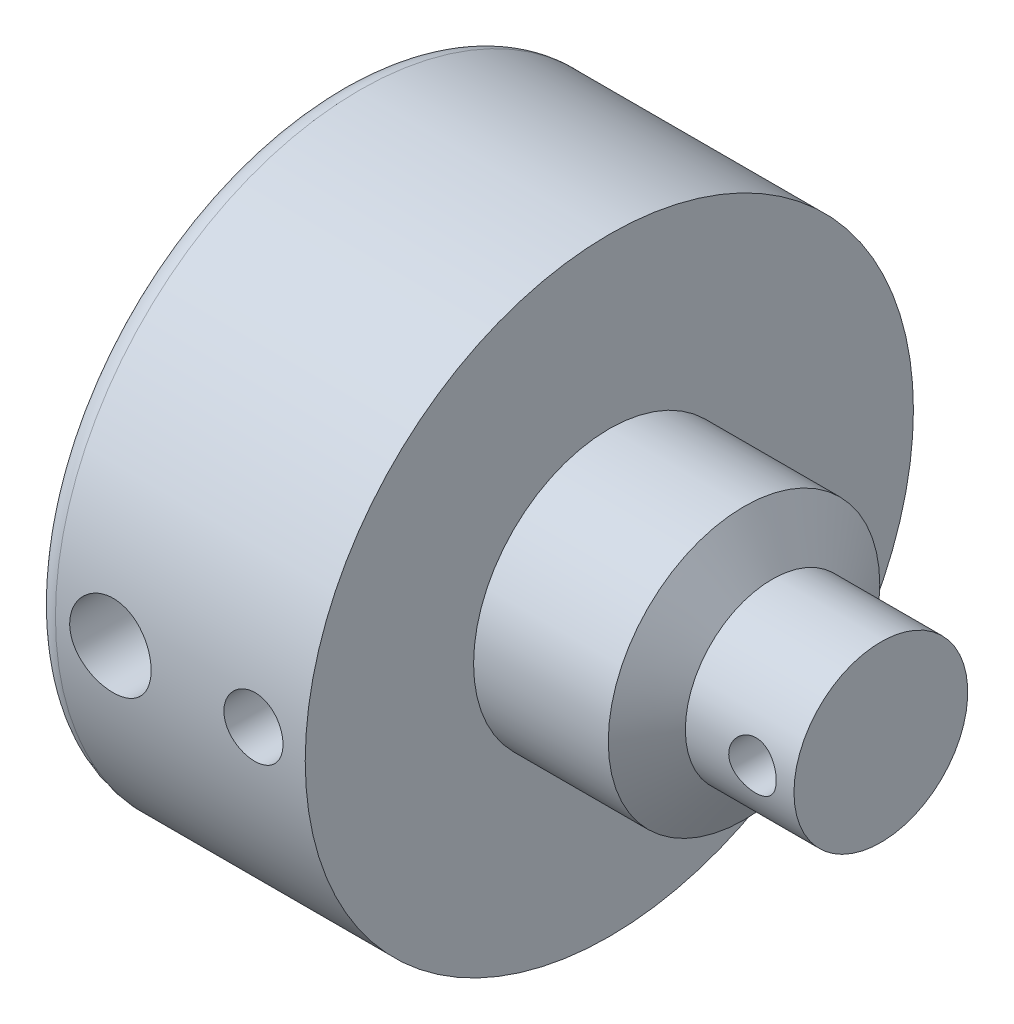
ISO-10303-21;
HEADER;
FILE_DESCRIPTION(('STEP AP214'),'2;1');
FILE_NAME('part.step','',(''),(''),'','','');
FILE_SCHEMA(('AUTOMOTIVE_DESIGN { 1 0 10303 214 1 1 1 1 }'));
ENDSEC;
DATA;
#1=APPLICATION_CONTEXT('core data for automotive mechanical design processes');
#2=APPLICATION_PROTOCOL_DEFINITION('international standard','automotive_design',2000,#1);
#3=PRODUCT_CONTEXT('',#1,'mechanical');
#4=PRODUCT('Part','Part','',(#3));
#5=PRODUCT_RELATED_PRODUCT_CATEGORY('part','',(#4));
#6=PRODUCT_DEFINITION_FORMATION('','',#4);
#7=PRODUCT_DEFINITION_CONTEXT('part definition',#1,'design');
#8=PRODUCT_DEFINITION('design','',#6,#7);
#9=PRODUCT_DEFINITION_SHAPE('','',#8);
#10=(LENGTH_UNIT() NAMED_UNIT(*) SI_UNIT(.MILLI.,.METRE.));
#11=(NAMED_UNIT(*) PLANE_ANGLE_UNIT() SI_UNIT($,.RADIAN.));
#12=(NAMED_UNIT(*) SI_UNIT($,.STERADIAN.) SOLID_ANGLE_UNIT());
#13=UNCERTAINTY_MEASURE_WITH_UNIT(LENGTH_MEASURE(1.E-05),#10,'distance_accuracy_value','');
#14=(GEOMETRIC_REPRESENTATION_CONTEXT(3) GLOBAL_UNCERTAINTY_ASSIGNED_CONTEXT((#13)) GLOBAL_UNIT_ASSIGNED_CONTEXT((#10,
#11,#12)) REPRESENTATION_CONTEXT('',''));
#15=CARTESIAN_POINT('',(0.,0.,0.));
#16=DIRECTION('',(0.,0.,1.));
#17=DIRECTION('',(1.,0.,0.));
#18=AXIS2_PLACEMENT_3D('',#15,#16,#17);
#19=CARTESIAN_POINT('',(0.,0.,0.));
#20=DIRECTION('',(1.,0.,0.));
#21=DIRECTION('',(0.,0.,-1.));
#22=AXIS2_PLACEMENT_3D('',#19,#20,#21);
#23=PLANE('',#22);
#24=CARTESIAN_POINT('',(0.,0.,0.));
#25=DIRECTION('',(1.,0.,0.));
#26=DIRECTION('',(0.,0.,-1.));
#27=AXIS2_PLACEMENT_3D('',#24,#25,#26);
#28=CIRCLE('',#27,16.51);
#29=CARTESIAN_POINT('',(0.,0.,-16.51));
#30=VERTEX_POINT('',#29);
#31=EDGE_CURVE('E42',#30,#30,#28,.F.);
#32=ORIENTED_EDGE('',*,*,#31,.T.);
#33=EDGE_LOOP('',(#32));
#34=FACE_BOUND('',#33,.T.);
#35=ADVANCED_FACE('F34',(#34),#23,.F.);
#36=CARTESIAN_POINT('',(-88.99,0.,0.));
#37=DIRECTION('',(-1.,0.,0.));
#38=DIRECTION('',(0.,0.,1.));
#39=AXIS2_PLACEMENT_3D('',#36,#37,#38);
#40=CYLINDRICAL_SURFACE('',#39,17.78);
#41=CARTESIAN_POINT('',(1.26999999999999,0.,0.));
#42=DIRECTION('',(1.,0.,0.));
#43=DIRECTION('',(0.,0.,-1.));
#44=AXIS2_PLACEMENT_3D('',#41,#42,#43);
#45=CIRCLE('',#44,17.78);
#46=CARTESIAN_POINT('',(1.26999999999999,0.,-17.78));
#47=VERTEX_POINT('',#46);
#48=EDGE_CURVE('E10',#47,#47,#45,.T.);
#49=ORIENTED_EDGE('',*,*,#48,.T.);
#50=EDGE_LOOP('',(#49));
#51=FACE_BOUND('',#50,.T.);
#52=CARTESIAN_POINT('',(6.86386760511532,0.,17.78));
#53=CARTESIAN_POINT('',(6.85958570639568,-0.133133219016853,17.7799980584345));
#54=CARTESIAN_POINT('',(6.84410431314223,-0.265988396244947,17.7784889957615));
#55=CARTESIAN_POINT('',(6.79116271506069,-0.527275768382753,17.7726619289018));
#56=CARTESIAN_POINT('',(6.7536798048931,-0.65570324878477,17.7683410224198));
#57=CARTESIAN_POINT('',(6.65786552293635,-0.90432595281292,17.7574229931684));
#58=CARTESIAN_POINT('',(6.59954915009691,-1.02452702500808,17.7508275080889));
#59=CARTESIAN_POINT('',(6.46374945336528,-1.25342643631558,17.73613528139));
#60=CARTESIAN_POINT('',(6.38626926597332,-1.36212665359555,17.728038785492));
#61=CARTESIAN_POINT('',(6.2138069431759,-1.5656503842034,17.7112292962343));
#62=CARTESIAN_POINT('',(6.11872709191141,-1.66039083910711,17.7025130370078));
#63=CARTESIAN_POINT('',(5.91400207890148,-1.83261118944869,17.6855151200962));
#64=CARTESIAN_POINT('',(5.80435623144925,-1.91009027183263,17.6772334828969));
#65=CARTESIAN_POINT('',(5.5732015521879,-2.04579054874751,17.6620450480345));
#66=CARTESIAN_POINT('',(5.45165867093433,-2.10395424447798,17.6551423792134));
#67=CARTESIAN_POINT('',(5.20041965511415,-2.19900129674456,17.643556940088));
#68=CARTESIAN_POINT('',(5.07072391305195,-2.23588567686521,17.6388740630086));
#69=CARTESIAN_POINT('',(4.8077792292829,-2.28709624740156,17.6323072956796));
#70=CARTESIAN_POINT('',(4.67455963630728,-2.30157075378135,17.6304050073018));
#71=CARTESIAN_POINT('',(4.40757254242092,-2.30799121638701,17.6295657596181));
#72=CARTESIAN_POINT('',(4.27380506415344,-2.29993809444908,17.6306286789751));
#73=CARTESIAN_POINT('',(4.01034682624993,-2.26166419910138,17.635578724522));
#74=CARTESIAN_POINT('',(3.88063666553803,-2.23157453867262,17.6394491453475));
#75=CARTESIAN_POINT('',(3.62811500502692,-2.15026691581748,17.6495444007049));
#76=CARTESIAN_POINT('',(3.50530370487538,-2.09904834229424,17.6557693033333));
#77=CARTESIAN_POINT('',(3.26949736252719,-1.97670650165135,17.6698845812371));
#78=CARTESIAN_POINT('',(3.15654464317299,-1.9055024651611,17.6777816820589));
#79=CARTESIAN_POINT('',(2.94412633229655,-1.7452857670472,17.6943167190002));
#80=CARTESIAN_POINT('',(2.84466142910759,-1.6562721971104,17.7029546928925));
#81=CARTESIAN_POINT('',(2.66124626052634,-1.46214887454438,17.7200470186109));
#82=CARTESIAN_POINT('',(2.57742130029724,-1.35692050628223,17.7284994454199));
#83=CARTESIAN_POINT('',(2.42860788486312,-1.13380956336479,17.7441641665386));
#84=CARTESIAN_POINT('',(2.36361934634153,-1.01592704468403,17.7513764663336));
#85=CARTESIAN_POINT('',(2.25439033526242,-0.770893885665809,17.76370302097));
#86=CARTESIAN_POINT('',(2.21013684398438,-0.643749118836235,17.7688185920115));
#87=CARTESIAN_POINT('',(2.14363527596981,-0.383753688892956,17.7763335104001));
#88=CARTESIAN_POINT('',(2.12138598910591,-0.25090333997865,17.7787330071195));
#89=CARTESIAN_POINT('',(2.09965025601776,0.015612492781322,17.780488572357));
#90=CARTESIAN_POINT('',(2.09998624282188,0.149263358908925,17.7798684174134));
#91=CARTESIAN_POINT('',(2.12296843250587,0.414582531976226,17.7756610795788));
#92=CARTESIAN_POINT('',(2.14561422868817,0.546250875011986,17.7720739507746));
#93=CARTESIAN_POINT('',(2.21244166352204,0.803492418330639,17.7623008588146));
#94=CARTESIAN_POINT('',(2.2565613472422,0.929082017407327,17.7561223790886));
#95=CARTESIAN_POINT('',(2.36502716275998,1.17107899233285,17.7418060638281));
#96=CARTESIAN_POINT('',(2.42937415773205,1.28748597606015,17.7336681446805));
#97=CARTESIAN_POINT('',(2.5769586308495,1.50864402126496,17.7162297083618));
#98=CARTESIAN_POINT('',(2.66031647451484,1.61331418506677,17.7069219608029));
#99=CARTESIAN_POINT('',(2.84335803136614,1.80723711167386,17.6881826277848));
#100=CARTESIAN_POINT('',(2.9430424261263,1.89648923051201,17.6787510371708));
#101=CARTESIAN_POINT('',(3.15662143880773,2.05757723474089,17.6607305500918));
#102=CARTESIAN_POINT('',(3.27059682735353,2.12930669000533,17.6521469831524));
#103=CARTESIAN_POINT('',(3.50909298024273,2.25260121134459,17.6368383120406));
#104=CARTESIAN_POINT('',(3.63361343362549,2.30416687177253,17.6301131530911));
#105=CARTESIAN_POINT('',(3.88916557003891,2.3854579223865,17.6192984620447));
#106=CARTESIAN_POINT('',(4.02016992328124,2.41526782573885,17.6151987387822));
#107=CARTESIAN_POINT('',(4.28537992784738,2.45247935407298,17.6100569371201));
#108=CARTESIAN_POINT('',(4.41958541289471,2.45988214040471,17.6090147002526));
#109=CARTESIAN_POINT('',(4.68627990667047,2.4520882707029,17.610101511427));
#110=CARTESIAN_POINT('',(4.81877415849664,2.43706624620115,17.6122060543651));
#111=CARTESIAN_POINT('',(5.07933538896001,2.38519216542068,17.6193057474439));
#112=CARTESIAN_POINT('',(5.20740233895642,2.34833996794774,17.6243009162807));
#113=CARTESIAN_POINT('',(5.45558700458868,2.25385893545025,17.6366316470663));
#114=CARTESIAN_POINT('',(5.57570007012536,2.19621807143315,17.6439685637427));
#115=CARTESIAN_POINT('',(5.80458100658957,2.06180846439726,17.6601786436772));
#116=CARTESIAN_POINT('',(5.91334863499238,1.98503931260317,17.6690518397646));
#117=CARTESIAN_POINT('',(6.11737208400474,1.8138300818362,17.687449563459));
#118=CARTESIAN_POINT('',(6.21251446797077,1.71925529617804,17.6969786796258));
#119=CARTESIAN_POINT('',(6.38563060987582,1.51543832904699,17.7155947532888));
#120=CARTESIAN_POINT('',(6.46360044267121,1.40619280343787,17.7246816093281));
#121=CARTESIAN_POINT('',(6.60037344731507,1.17569856539288,17.7414633327103));
#122=CARTESIAN_POINT('',(6.65911027497614,1.05441014712695,17.7491533418606));
#123=CARTESIAN_POINT('',(6.75528356120772,0.803647655080538,17.7622704727334));
#124=CARTESIAN_POINT('',(6.79274293227899,0.674182553948143,17.7677000269237));
#125=CARTESIAN_POINT('',(6.8368347283638,0.453362235511105,17.7744441014818));
#126=CARTESIAN_POINT('',(6.8495142243945,0.36319124087437,17.77652114039));
#127=CARTESIAN_POINT('',(6.8644927280359,0.181970266888062,17.7792997463594));
#128=CARTESIAN_POINT('',(6.86679183018841,0.0909202955515396,17.7800013259479));
#129=CARTESIAN_POINT('',(6.86386760511532,0.,17.78));
#130=B_SPLINE_CURVE_WITH_KNOTS('',3,(#52,#53,#54,#55,#56,#57,#58,#59,#60,#61,#62,#63,#64,#65,
#66,#67,#68,#69,#70,#71,#72,#73,#74,#75,#76,#77,#78,#79,#80,#81,#82,#83,#84,#85,#86,#87,#88,#89,
#90,#91,#92,#93,#94,#95,#96,#97,#98,#99,#100,#101,#102,#103,#104,#105,#106,#107,#108,#109,#110,
#111,#112,#113,#114,#115,#116,#117,#118,#119,#120,#121,#122,#123,#124,#125,#126,#127,#128,#129),
.UNSPECIFIED.,.T.,.F.,(4,2,2,2,2,2,2,2,2,2,2,2,2,2,2,2,2,2,2,2,2,2,2,2,2,2,2,2,2,2,2,2,2,2,2,2,
2,2,4),(0.,0.399273542317246,0.798959857073893,1.19835899759977,1.59769281253483,
1.99931417559296,2.40095445202642,2.80377984779257,3.206585865105,3.60671440662996,
4.0068265750338,4.40457729970184,4.80233952904436,5.2017330144915,5.60114687480519,
6.00363493728698,6.40612121947135,6.80835445660121,7.21056557157178,7.609614847844,
8.00865684976575,8.40655432805956,8.8044687884214,9.20497621795633,9.60550037148548,
10.0083999220181,10.4112875956864,10.8126017442171,11.213895092475,11.6120796579748,
12.0102667988997,12.4086847143693,12.8071111448388,13.2086826633523,13.610345874348,
14.0133803724696,14.415980038504,14.6886572814534,14.9613320409272),.UNSPECIFIED.);
#131=CARTESIAN_POINT('',(6.86386760511532,0.,17.78));
#132=VERTEX_POINT('',#131);
#133=EDGE_CURVE('E48',#132,#132,#130,.T.);
#134=ORIENTED_EDGE('',*,*,#133,.T.);
#135=EDGE_LOOP('',(#134));
#136=FACE_BOUND('',#135,.T.);
#137=CARTESIAN_POINT('',(4.48384506152944,-2.45698699449018,-17.6094183580522));
#138=CARTESIAN_POINT('',(4.61695579102001,-2.45698139443148,-17.6094204111506));
#139=CARTESIAN_POINT('',(4.7501477261366,-2.44579472551361,-17.6109911914985));
#140=CARTESIAN_POINT('',(5.01281908287056,-2.40134848208744,-17.6171055877044));
#141=CARTESIAN_POINT('',(5.14229457091657,-2.3680663592834,-17.6216522403576));
#142=CARTESIAN_POINT('',(5.39369227998193,-2.28043137488042,-17.6332065571522));
#143=CARTESIAN_POINT('',(5.51561978185678,-2.22609344244245,-17.6402124772732));
#144=CARTESIAN_POINT('',(5.7486000661167,-2.09791994885535,-17.6559134886237));
#145=CARTESIAN_POINT('',(5.85965458126951,-2.02408750139497,-17.664608310041));
#146=CARTESIAN_POINT('',(6.0684687495902,-1.85851174841175,-17.6827964470673));
#147=CARTESIAN_POINT('',(6.1661486574396,-1.76666833209071,-17.6922940487103));
#148=CARTESIAN_POINT('',(6.34475122702087,-1.5678901244732,-17.7110153998516));
#149=CARTESIAN_POINT('',(6.42567302629806,-1.46095455693642,-17.7202391352345));
#150=CARTESIAN_POINT('',(6.56875136840333,-1.23451975126827,-17.7374542230254));
#151=CARTESIAN_POINT('',(6.63083527468014,-1.11497421829503,-17.7454407484296));
#152=CARTESIAN_POINT('',(6.73400996448099,-0.867027742796573,-17.7592810253214));
#153=CARTESIAN_POINT('',(6.77510163775906,-0.738627175853085,-17.7651348671995));
#154=CARTESIAN_POINT('',(6.83488587638111,-0.477431277215584,-17.7740660601771));
#155=CARTESIAN_POINT('',(6.85371140762051,-0.34466695022754,-17.7771598657275));
#156=CARTESIAN_POINT('',(6.86884132097137,-0.0778284596777565,-17.7803301698352));
#157=CARTESIAN_POINT('',(6.86514671249876,0.0562456449071287,-17.7804068036295));
#158=CARTESIAN_POINT('',(6.83544723301046,0.320992086994914,-17.7775921884086));
#159=CARTESIAN_POINT('',(6.80958537878025,0.451680710144564,-17.7747199412907));
#160=CARTESIAN_POINT('',(6.73650940733452,0.706857393180886,-17.7664025714509));
#161=CARTESIAN_POINT('',(6.68929483427894,0.831345320631476,-17.7609573938016));
#162=CARTESIAN_POINT('',(6.57470350642792,1.07102425999765,-17.7481201809824));
#163=CARTESIAN_POINT('',(6.5072654290608,1.18618562307738,-17.7407222328294));
#164=CARTESIAN_POINT('',(6.35418607192318,1.40361594252604,-17.7248459687285));
#165=CARTESIAN_POINT('',(6.26854383452122,1.505884220202,-17.7163675959541));
#166=CARTESIAN_POINT('',(6.08068763620274,1.69546369132079,-17.699235920183));
#167=CARTESIAN_POINT('',(5.97834895383694,1.78265126652442,-17.6905817666875));
#168=CARTESIAN_POINT('',(5.76043173511426,1.93862852803056,-17.6741701298749));
#169=CARTESIAN_POINT('',(5.64485314539114,2.00741814017247,-17.6664126501723));
#170=CARTESIAN_POINT('',(5.40362053676357,2.12465413906933,-17.6526980223655));
#171=CARTESIAN_POINT('',(5.27796118771723,2.17308967816899,-17.6467418347285));
#172=CARTESIAN_POINT('',(5.02019555582382,2.24812573455412,-17.6373403313954));
#173=CARTESIAN_POINT('',(4.88808963192398,2.27472746608615,-17.6338948760707));
#174=CARTESIAN_POINT('',(4.62227537269179,2.30517369958307,-17.6299407812416));
#175=CARTESIAN_POINT('',(4.48858734589813,2.30919269816107,-17.6294096237338));
#176=CARTESIAN_POINT('',(4.22244522364636,2.29482047400357,-17.6312860975552));
#177=CARTESIAN_POINT('',(4.08999109796462,2.27642980164071,-17.6336936567108));
#178=CARTESIAN_POINT('',(3.83060522113766,2.21790847739368,-17.6411489869354));
#179=CARTESIAN_POINT('',(3.70365389690635,2.17786313717458,-17.6461863946653));
#180=CARTESIAN_POINT('',(3.45826332849551,2.07725922253922,-17.6583109636757));
#181=CARTESIAN_POINT('',(3.33982442512084,2.0166998273724,-17.6653982069666));
#182=CARTESIAN_POINT('',(3.11403414809294,1.87636380160495,-17.6808555625015));
#183=CARTESIAN_POINT('',(3.00675409212219,1.79647326662005,-17.6892331674134));
#184=CARTESIAN_POINT('',(2.80705630778461,1.61990609035729,-17.7062743455213));
#185=CARTESIAN_POINT('',(2.71463924544246,1.52322869724806,-17.7149379315115));
#186=CARTESIAN_POINT('',(2.54667358988012,1.31507116077532,-17.731608502625));
#187=CARTESIAN_POINT('',(2.47123992686293,1.20349785021792,-17.7396107950099));
#188=CARTESIAN_POINT('',(2.34017943495022,0.969169325091413,-17.7539536547885));
#189=CARTESIAN_POINT('',(2.28455215715091,0.84641436402914,-17.7602942598429));
#190=CARTESIAN_POINT('',(2.19487121769505,0.593583763687526,-17.7705375010892));
#191=CARTESIAN_POINT('',(2.16075234722457,0.46353156657275,-17.7744475058268));
#192=CARTESIAN_POINT('',(2.11484494118335,0.199492376845227,-17.7793708440008));
#193=CARTESIAN_POINT('',(2.10305524185582,0.0655055896659679,-17.7803843283999));
#194=CARTESIAN_POINT('',(2.1021648313499,-0.201479190728729,-17.7793557189366));
#195=CARTESIAN_POINT('',(2.11288737190209,-0.334476720665319,-17.7773374633044));
#196=CARTESIAN_POINT('',(2.15634120498969,-0.596748427999413,-17.7704672470181));
#197=CARTESIAN_POINT('',(2.18907246549049,-0.726022610816117,-17.7656152904885));
#198=CARTESIAN_POINT('',(2.27555662244303,-0.977147747171236,-17.7535740403793));
#199=CARTESIAN_POINT('',(2.3292997632499,-1.09900211536821,-17.7463858317634));
#200=CARTESIAN_POINT('',(2.4562637025817,-1.33198363265894,-17.7304222025116));
#201=CARTESIAN_POINT('',(2.5294848701334,-1.44311057845874,-17.7216467518052));
#202=CARTESIAN_POINT('',(2.69397558909785,-1.65238640440449,-17.7033655886921));
#203=CARTESIAN_POINT('',(2.78537637773557,-1.75043170418363,-17.6938548931877));
#204=CARTESIAN_POINT('',(2.98335720670652,-1.92986084409845,-17.6751859019877));
#205=CARTESIAN_POINT('',(3.08994082347007,-2.01124074753258,-17.6660276899697));
#206=CARTESIAN_POINT('',(3.31580969194198,-2.15534701525348,-17.6490278341039));
#207=CARTESIAN_POINT('',(3.43514917933492,-2.21798904983643,-17.6411922094125));
#208=CARTESIAN_POINT('',(3.68269819317237,-2.32226033992483,-17.6277705683827));
#209=CARTESIAN_POINT('',(3.81089805221516,-2.36391209850436,-17.6221821441897));
#210=CARTESIAN_POINT('',(4.03041852085262,-2.41522407418137,-17.615206755328));
#211=CARTESIAN_POINT('',(4.12036348640119,-2.43086220398069,-17.6130469044275));
#212=CARTESIAN_POINT('',(4.3014746215662,-2.45174553466996,-17.6101520090002));
#213=CARTESIAN_POINT('',(4.39264077989962,-2.45699083151619,-17.6094169513184));
#214=CARTESIAN_POINT('',(4.48384506152944,-2.45698699449018,-17.6094183580522));
#215=B_SPLINE_CURVE_WITH_KNOTS('',3,(#137,#138,#139,#140,#141,#142,#143,#144,#145,#146,#147,
#148,#149,#150,#151,#152,#153,#154,#155,#156,#157,#158,#159,#160,#161,#162,#163,#164,#165,#166,
#167,#168,#169,#170,#171,#172,#173,#174,#175,#176,#177,#178,#179,#180,#181,#182,#183,#184,#185,
#186,#187,#188,#189,#190,#191,#192,#193,#194,#195,#196,#197,#198,#199,#200,#201,#202,#203,#204,
#205,#206,#207,#208,#209,#210,#211,#212,#213,#214),.UNSPECIFIED.,.T.,.F.,(4,2,2,2,2,2,2,2,2,2,2,
2,2,2,2,2,2,2,2,2,2,2,2,2,2,2,2,2,2,2,2,2,2,2,2,2,2,2,4),(0.,0.398998946937477,
0.798405697408037,1.19752977391187,1.59659014033251,1.9979349178396,2.39930034539231,
2.80219427642338,3.20507112941207,3.60552979164171,4.00597050432091,4.40384696762638,
4.80173192524086,5.20083578016219,5.59996063517552,6.00221628516238,6.40447355658263,
6.80694493901428,7.20939393723223,7.60872889328698,8.00805404203099,8.40581733335358,
8.80359654074004,9.20377922940057,9.60397984562912,10.0068123291015,10.4096356819559,
10.8112318130134,11.2128070130169,11.6112411570913,12.0096747212296,12.4079235151736,
12.8061798547963,13.2074229533575,13.6087607245488,14.0118784407294,14.4145630616365,
14.6879501015881,14.961334617365),.UNSPECIFIED.);
#216=CARTESIAN_POINT('',(4.48384506152944,-2.45698699449018,-17.6094183580522));
#217=VERTEX_POINT('',#216);
#218=EDGE_CURVE('E62',#217,#217,#215,.T.);
#219=ORIENTED_EDGE('',*,*,#218,.T.);
#220=EDGE_LOOP('',(#219));
#221=FACE_BOUND('',#220,.T.);
#222=CARTESIAN_POINT('',(14.5652504951277,0.,17.78));
#223=CARTESIAN_POINT('',(14.5556704085737,-0.0964046661283412,17.779998967886));
#224=CARTESIAN_POINT('',(14.5379553512263,-0.192066464898692,17.7792077489266));
#225=CARTESIAN_POINT('',(14.4867416174509,-0.379122146719337,17.7762045484632));
#226=CARTESIAN_POINT('',(14.4532251532419,-0.470511092019783,17.7739909647692));
#227=CARTESIAN_POINT('',(14.3713970121009,-0.646308670908005,17.7684669358356));
#228=CARTESIAN_POINT('',(14.3230944678818,-0.730721572533653,17.7651571675581));
#229=CARTESIAN_POINT('',(14.2130723050978,-0.890233679990863,17.7578790774599));
#230=CARTESIAN_POINT('',(14.1513554810057,-0.96533482054573,17.7539108928417));
#231=CARTESIAN_POINT('',(14.0160245510129,-1.10435952033824,17.7458069291774));
#232=CARTESIAN_POINT('',(13.9423748886575,-1.16824844699032,17.7416706778261));
#233=CARTESIAN_POINT('',(13.7853779963928,-1.2827636170685,17.7337594094191));
#234=CARTESIAN_POINT('',(13.7020304202388,-1.33338938674984,17.7299844052697));
#235=CARTESIAN_POINT('',(13.5279498195952,-1.41994559854923,17.7232629278947));
#236=CARTESIAN_POINT('',(13.4372138190354,-1.45587008350496,17.7203167906882));
#237=CARTESIAN_POINT('',(13.2509636240213,-1.51194853626405,17.7156205138802));
#238=CARTESIAN_POINT('',(13.1554495689924,-1.53210296395821,17.7138703394019));
#239=CARTESIAN_POINT('',(12.9627646942048,-1.55600100147949,17.7117872251446));
#240=CARTESIAN_POINT('',(12.8656020606195,-1.5598101393392,17.7114486265341));
#241=CARTESIAN_POINT('',(12.672020489026,-1.55108511285904,17.7122148027016));
#242=CARTESIAN_POINT('',(12.5756015391016,-1.53855121093547,17.713319554304));
#243=CARTESIAN_POINT('',(12.3864592526197,-1.49755360199038,17.7168324011958));
#244=CARTESIAN_POINT('',(12.2937283281344,-1.46912463130521,17.7192376540546));
#245=CARTESIAN_POINT('',(12.1143485837427,-1.39718347448946,17.7250549450996));
#246=CARTESIAN_POINT('',(12.0276998965264,-1.35367095941911,17.728467005242));
#247=CARTESIAN_POINT('',(11.8626516823836,-1.2526462507556,17.7358913078975));
#248=CARTESIAN_POINT('',(11.7842782495086,-1.19509156257959,17.7399053576768));
#249=CARTESIAN_POINT('',(11.6382738484978,-1.06767691669617,17.7480289132203));
#250=CARTESIAN_POINT('',(11.5706431324973,-0.997816670254319,17.7521384212222));
#251=CARTESIAN_POINT('',(11.4478011045918,-0.847481937894421,17.7599506899272));
#252=CARTESIAN_POINT('',(11.3926344205769,-0.766970897668338,17.763651965474));
#253=CARTESIAN_POINT('',(11.2965972860118,-0.597797359953364,17.7701489514908));
#254=CARTESIAN_POINT('',(11.2557266861594,-0.509134947606033,17.772944671418));
#255=CARTESIAN_POINT('',(11.1895100549897,-0.326309141603019,17.7772400427866));
#256=CARTESIAN_POINT('',(11.1641410236471,-0.23215412596149,17.7787416157485));
#257=CARTESIAN_POINT('',(11.1295738572758,-0.0409101613775177,17.7802099421331));
#258=CARTESIAN_POINT('',(11.1203752606506,0.0561787037356185,17.7801767393677));
#259=CARTESIAN_POINT('',(11.1184225998569,0.250103043123019,17.7785042211149));
#260=CARTESIAN_POINT('',(11.125600415699,0.346937895721742,17.7768715748648));
#261=CARTESIAN_POINT('',(11.1560497089689,0.538004631763194,17.7721154250965));
#262=CARTESIAN_POINT('',(11.1793211541672,0.632236520418307,17.768991924564));
#263=CARTESIAN_POINT('',(11.2412712777986,0.815400439449589,17.761529422981));
#264=CARTESIAN_POINT('',(11.2799444058547,0.904334365819117,17.7571908599753));
#265=CARTESIAN_POINT('',(11.3715931804785,1.07445234459267,17.7477102546321));
#266=CARTESIAN_POINT('',(11.4245692091595,1.15563618986873,17.74256819083));
#267=CARTESIAN_POINT('',(11.5435697950157,1.3083009585657,17.7319665334559));
#268=CARTESIAN_POINT('',(11.6096455249142,1.37974191383063,17.7265057558429));
#269=CARTESIAN_POINT('',(11.7528553730191,1.51053873304728,17.7158400721249));
#270=CARTESIAN_POINT('',(11.8299896611299,1.56989441128625,17.7106351699528));
#271=CARTESIAN_POINT('',(11.9933338797972,1.67496289473373,17.7010084112447));
#272=CARTESIAN_POINT('',(12.0795631356259,1.7206458243996,17.696588277906));
#273=CARTESIAN_POINT('',(12.2585198741576,1.79688416919273,17.689010244044));
#274=CARTESIAN_POINT('',(12.3512472091201,1.82743992812446,17.6858523148342));
#275=CARTESIAN_POINT('',(12.5402685079858,1.87246745843137,17.6811419779243));
#276=CARTESIAN_POINT('',(12.6365507229344,1.88698803303922,17.6795846996354));
#277=CARTESIAN_POINT('',(12.8301982660517,1.8996868315969,17.6782248123751));
#278=CARTESIAN_POINT('',(12.927563570322,1.89786541542139,17.6784221647641));
#279=CARTESIAN_POINT('',(13.1202506321571,1.87797009045567,17.6805465172335));
#280=CARTESIAN_POINT('',(13.2155783848409,1.85995351161333,17.6824674160147));
#281=CARTESIAN_POINT('',(13.4018471119191,1.80827005818184,17.6878271241017));
#282=CARTESIAN_POINT('',(13.4927880329331,1.77460299320531,17.691265951873));
#283=CARTESIAN_POINT('',(13.6678632872445,1.69251897572906,17.6993071606047));
#284=CARTESIAN_POINT('',(13.7519869526047,1.64407945001205,17.7039113204193));
#285=CARTESIAN_POINT('',(13.9109209071015,1.53383904652509,17.7138022427383));
#286=CARTESIAN_POINT('',(13.9857312593889,1.47203825936173,17.7190890006136));
#287=CARTESIAN_POINT('',(14.1242407400384,1.33652384557754,17.729826058845));
#288=CARTESIAN_POINT('',(14.1878931508987,1.26276250866268,17.7352769398696));
#289=CARTESIAN_POINT('',(14.3019271137944,1.10555485114277,17.745769731252));
#290=CARTESIAN_POINT('',(14.3523056208944,1.02210631467915,17.7508115475901));
#291=CARTESIAN_POINT('',(14.4383686449126,0.847826698037671,17.7599889295486));
#292=CARTESIAN_POINT('',(14.4740415716661,0.756989862039869,17.7641237791493));
#293=CARTESIAN_POINT('',(14.5295686778879,0.570631899737716,17.7710844027205));
#294=CARTESIAN_POINT('',(14.5494408755878,0.475116241279939,17.7739116662419));
#295=CARTESIAN_POINT('',(14.5687643727623,0.315870389340035,17.7773055915145));
#296=CARTESIAN_POINT('',(14.5729223723245,0.252682357167164,17.7783168511622));
#297=CARTESIAN_POINT('',(14.5742933822284,0.12622395679463,17.7796643908211));
#298=CARTESIAN_POINT('',(14.5715064250068,0.062953588980898,17.7800006739848));
#299=CARTESIAN_POINT('',(14.5652504951277,0.,17.78));
#300=B_SPLINE_CURVE_WITH_KNOTS('',3,(#222,#223,#224,#225,#226,#227,#228,#229,#230,#231,#232,
#233,#234,#235,#236,#237,#238,#239,#240,#241,#242,#243,#244,#245,#246,#247,#248,#249,#250,#251,
#252,#253,#254,#255,#256,#257,#258,#259,#260,#261,#262,#263,#264,#265,#266,#267,#268,#269,#270,
#271,#272,#273,#274,#275,#276,#277,#278,#279,#280,#281,#282,#283,#284,#285,#286,#287,#288,#289,
#290,#291,#292,#293,#294,#295,#296,#297,#298,#299),.UNSPECIFIED.,.T.,.F.,(4,2,2,2,2,2,2,2,2,2,2,
2,2,2,2,2,2,2,2,2,2,2,2,2,2,2,2,2,2,2,2,2,2,2,2,2,2,2,4),(0.,0.290407195997547,
0.581142089344808,0.871697769603058,1.16219297900009,1.45357026217873,1.74495795160113,
2.03646359867611,2.32796074446523,2.6182881841303,2.90861096213408,3.19830174834631,
3.48799885249104,3.77858375874671,4.06917548412012,4.360791751207,4.65240497269083,
4.94358446376926,5.23475564278621,5.52471786365616,5.81467950384052,6.10453674360075,
6.39440172789225,6.68542218247547,6.97644710879204,7.26810337094327,7.55975300413998,
7.85051253145316,8.14126565582988,8.430993566567,8.72072500192198,9.0109014018686,
9.30107583410686,9.59243760354864,9.88386615115171,10.1755239502745,10.466848680906,
10.6564895082245,10.8461294498181),.UNSPECIFIED.);
#301=CARTESIAN_POINT('',(14.5652504951277,0.,17.78));
#302=VERTEX_POINT('',#301);
#303=EDGE_CURVE('E97',#302,#302,#300,.T.);
#304=ORIENTED_EDGE('',*,*,#303,.T.);
#305=EDGE_LOOP('',(#304));
#306=FACE_BOUND('',#305,.T.);
#307=CARTESIAN_POINT('',(12.8465093701628,-1.89704304600616,-17.6785075071851));
#308=CARTESIAN_POINT('',(12.9432810586591,-1.89703885804254,-17.6785086517891));
#309=CARTESIAN_POINT('',(13.0401170822392,-1.8888908445417,-17.6793881887916));
#310=CARTESIAN_POINT('',(13.2311053272423,-1.85650869855806,-17.6828173749352));
#311=CARTESIAN_POINT('',(13.32525445501,-1.83225674644677,-17.6853688741257));
#312=CARTESIAN_POINT('',(13.5080753910044,-1.76837679788339,-17.6918701092458));
#313=CARTESIAN_POINT('',(13.5967504433109,-1.72875801161422,-17.6958190075138));
#314=CARTESIAN_POINT('',(13.7661664479918,-1.63528359888435,-17.7047011023419));
#315=CARTESIAN_POINT('',(13.8469089938161,-1.58143083974062,-17.709634100614));
#316=CARTESIAN_POINT('',(13.9984652278366,-1.4608144361587,-17.7199911253129));
#317=CARTESIAN_POINT('',(14.0692478090807,-1.39401182656222,-17.725416606707));
#318=CARTESIAN_POINT('',(14.198607101736,-1.24947119579962,-17.7361907668665));
#319=CARTESIAN_POINT('',(14.2571832593871,-1.17173267877984,-17.7415394421372));
#320=CARTESIAN_POINT('',(14.3605738090539,-1.00733358013524,-17.7516327213169));
#321=CARTESIAN_POINT('',(14.4053607700703,-0.920655666484134,-17.756376110293));
#322=CARTESIAN_POINT('',(14.4797261061793,-0.740955306120609,-17.764781654876));
#323=CARTESIAN_POINT('',(14.5093048326841,-0.647933006062351,-17.7684438354653));
#324=CARTESIAN_POINT('',(14.5523231084802,-0.45849566700288,-17.7743390565872));
#325=CARTESIAN_POINT('',(14.5658136259472,-0.362092343779255,-17.7765765998782));
#326=CARTESIAN_POINT('',(14.5764302155117,-0.168366493398073,-17.7794666758042));
#327=CARTESIAN_POINT('',(14.5735566898285,-0.0710439888921952,-17.7801192473964));
#328=CARTESIAN_POINT('',(14.5515681928839,0.121411423990042,-17.779845083354));
#329=CARTESIAN_POINT('',(14.5325080282961,0.216550609830104,-17.7789236664834));
#330=CARTESIAN_POINT('',(14.4787726533902,0.40228651163499,-17.7756912325471));
#331=CARTESIAN_POINT('',(14.4440972500673,0.492883171438712,-17.7733801983056));
#332=CARTESIAN_POINT('',(14.3600554298295,0.667132886051648,-17.7676941072957));
#333=CARTESIAN_POINT('',(14.3106647062429,0.75077415730322,-17.764317289521));
#334=CARTESIAN_POINT('',(14.1986119160939,0.90860670271979,-17.7569447258694));
#335=CARTESIAN_POINT('',(14.1359494823867,0.982797715364507,-17.752948962871));
#336=CARTESIAN_POINT('',(13.998823673679,1.1199410538556,-17.7448268806757));
#337=CARTESIAN_POINT('',(13.9243126318233,1.1828457007733,-17.7407000904561));
#338=CARTESIAN_POINT('',(13.765770124781,1.29525767194258,-17.7328478528045));
#339=CARTESIAN_POINT('',(13.6817386470273,1.34476497850902,-17.7291224059023));
#340=CARTESIAN_POINT('',(13.5065045528702,1.42897299847723,-17.7225345037347));
#341=CARTESIAN_POINT('',(13.4153005550845,1.46367085135995,-17.7196722152238));
#342=CARTESIAN_POINT('',(13.2283280800484,1.51723509486742,-17.7151665702816));
#343=CARTESIAN_POINT('',(13.1325597339518,1.5361019400973,-17.7135231788485));
#344=CARTESIAN_POINT('',(12.9395954143154,1.55740590437024,-17.7116629067603));
#345=CARTESIAN_POINT('',(12.8424068605234,1.55990974874407,-17.7114402327671));
#346=CARTESIAN_POINT('',(12.6489936722782,1.54859158865659,-17.7124333478103));
#347=CARTESIAN_POINT('',(12.5527690255625,1.5347697921503,-17.7136491185239));
#348=CARTESIAN_POINT('',(12.364208898839,1.49124958554046,-17.7173656390231));
#349=CARTESIAN_POINT('',(12.271866099277,1.46158264825905,-17.719863841165));
#350=CARTESIAN_POINT('',(12.0934635618878,1.38724864817667,-17.7258377354165));
#351=CARTESIAN_POINT('',(12.0074039601594,1.34258126057192,-17.729313448692));
#352=CARTESIAN_POINT('',(11.8437066444429,1.23935000432326,-17.7368285871422));
#353=CARTESIAN_POINT('',(11.7660969138066,1.18074189372384,-17.7408697897777));
#354=CARTESIAN_POINT('',(11.6217859914537,1.05136012724812,-17.7490065212793));
#355=CARTESIAN_POINT('',(11.5550850546434,0.980586187171488,-17.7531020514127));
#356=CARTESIAN_POINT('',(11.4342556464239,0.828596458498658,-17.7608453234656));
#357=CARTESIAN_POINT('',(11.3801706331564,0.747346031114207,-17.7644914977264));
#358=CARTESIAN_POINT('',(11.2864072365524,0.576884911030952,-17.7708432047253));
#359=CARTESIAN_POINT('',(11.2467286655142,0.487674322063947,-17.773548749719));
#360=CARTESIAN_POINT('',(11.1829783018823,0.303980609911362,-17.7776380450548));
#361=CARTESIAN_POINT('',(11.1588801459948,0.209506688552019,-17.7790240300852));
#362=CARTESIAN_POINT('',(11.1268886078736,0.0178447069450463,-17.7802491816054));
#363=CARTESIAN_POINT('',(11.1189947976676,-0.0793432815527381,-17.7800883889479));
#364=CARTESIAN_POINT('',(11.1196418514041,-0.273246845010996,-17.7781635415824));
#365=CARTESIAN_POINT('',(11.1281152028804,-0.36996271789794,-17.7764060887309));
#366=CARTESIAN_POINT('',(11.1611146274136,-0.56057584554728,-17.7714166010253));
#367=CARTESIAN_POINT('',(11.1856407149691,-0.654473097763866,-17.7681845648392));
#368=CARTESIAN_POINT('',(11.2500309763511,-0.836785817410766,-17.7605326487933));
#369=CARTESIAN_POINT('',(11.2898933104998,-0.925201940859905,-17.7561129114248));
#370=CARTESIAN_POINT('',(11.3838172473696,-1.09409052394238,-17.7465075263098));
#371=CARTESIAN_POINT('',(11.4378787411699,-1.17456304450401,-17.7413218844386));
#372=CARTESIAN_POINT('',(11.5589196979214,-1.32562937918508,-17.7306760578305));
#373=CARTESIAN_POINT('',(11.6259493951334,-1.39618287325494,-17.7252148685901));
#374=CARTESIAN_POINT('',(11.7709261234888,-1.52507289249866,-17.7145913492438));
#375=CARTESIAN_POINT('',(11.8488757748579,-1.58340647711704,-17.7094290912874));
#376=CARTESIAN_POINT('',(12.0136842736751,-1.68631439207831,-17.6999273769652));
#377=CARTESIAN_POINT('',(12.1005642027105,-1.73085511987481,-17.6955899398093));
#378=CARTESIAN_POINT('',(12.280558368415,-1.80466823960374,-17.6882153194186));
#379=CARTESIAN_POINT('',(12.3736654125993,-1.83395791462498,-17.6851766650554));
#380=CARTESIAN_POINT('',(12.5305047328894,-1.86910707220542,-17.6814881104856));
#381=CARTESIAN_POINT('',(12.5932331484983,-1.87956885051169,-17.6803753058903));
#382=CARTESIAN_POINT('',(12.7194682577358,-1.89353819862289,-17.6788846299354));
#383=CARTESIAN_POINT('',(12.7829749483259,-1.89704579556908,-17.6785067557075));
#384=CARTESIAN_POINT('',(12.8465093701628,-1.89704304600616,-17.6785075071851));
#385=B_SPLINE_CURVE_WITH_KNOTS('',3,(#307,#308,#309,#310,#311,#312,#313,#314,#315,#316,#317,
#318,#319,#320,#321,#322,#323,#324,#325,#326,#327,#328,#329,#330,#331,#332,#333,#334,#335,#336,
#337,#338,#339,#340,#341,#342,#343,#344,#345,#346,#347,#348,#349,#350,#351,#352,#353,#354,#355,
#356,#357,#358,#359,#360,#361,#362,#363,#364,#365,#366,#367,#368,#369,#370,#371,#372,#373,#374,
#375,#376,#377,#378,#379,#380,#381,#382,#383,#384),.UNSPECIFIED.,.T.,.F.,(4,2,2,2,2,2,2,2,2,2,2,
2,2,2,2,2,2,2,2,2,2,2,2,2,2,2,2,2,2,2,2,2,2,2,2,2,2,2,4),(0.,0.290083056525935,
0.580487637220733,0.870718430883076,1.160890804434,1.45195023145723,1.74302285989299,
2.03467083578801,2.32631207235487,2.61702690078492,2.90773458363301,3.19746185990238,
3.48719271730551,3.77740482888955,4.0676249698699,4.35904366330602,4.65046274142699,
4.94193808313513,5.23340505451567,5.52368273118139,5.8139567103475,6.10365625786893,
6.39336207864051,6.68399986691807,6.97464444557395,7.26627589255221,7.55790353972848,
7.84903642941547,8.14016162990352,8.43008853985768,8.72001571166918,9.00990811575876,
9.29979829616916,9.59083474446682,9.88194114649322,10.1737512698401,10.4652299788687,
10.6556816646745,10.8461326071708),.UNSPECIFIED.);
#386=CARTESIAN_POINT('',(12.8465093701628,-1.89704304600616,-17.6785075071851));
#387=VERTEX_POINT('',#386);
#388=EDGE_CURVE('E217',#387,#387,#385,.T.);
#389=ORIENTED_EDGE('',*,*,#388,.T.);
#390=EDGE_LOOP('',(#389));
#391=FACE_BOUND('',#390,.T.);
#392=CARTESIAN_POINT('',(15.875,0.,0.));
#393=DIRECTION('',(-1.,0.,0.));
#394=DIRECTION('',(0.,0.,1.));
#395=AXIS2_PLACEMENT_3D('',#392,#393,#394);
#396=CIRCLE('',#395,17.78);
#397=CARTESIAN_POINT('',(15.875,0.,17.78));
#398=VERTEX_POINT('',#397);
#399=EDGE_CURVE('E222',#398,#398,#396,.T.);
#400=ORIENTED_EDGE('',*,*,#399,.T.);
#401=EDGE_LOOP('',(#400));
#402=FACE_BOUND('',#401,.T.);
#403=ADVANCED_FACE('F67',(#51,#136,#221,#306,#391,#402),#40,.T.);
#404=CARTESIAN_POINT('',(15.875,17.78,0.));
#405=DIRECTION('',(-1.,0.,0.));
#406=DIRECTION('',(0.,0.,1.));
#407=AXIS2_PLACEMENT_3D('',#404,#405,#406);
#408=PLANE('',#407);
#409=ORIENTED_EDGE('',*,*,#399,.F.);
#410=EDGE_LOOP('',(#409));
#411=FACE_BOUND('',#410,.T.);
#412=CARTESIAN_POINT('',(15.875,0.,0.));
#413=DIRECTION('',(-1.,0.,0.));
#414=DIRECTION('',(0.,0.,1.));
#415=AXIS2_PLACEMENT_3D('',#412,#413,#414);
#416=CIRCLE('',#415,7.9375);
#417=CARTESIAN_POINT('',(15.875,0.,7.9375));
#418=VERTEX_POINT('',#417);
#419=EDGE_CURVE('E226',#418,#418,#416,.T.);
#420=ORIENTED_EDGE('',*,*,#419,.T.);
#421=EDGE_LOOP('',(#420));
#422=FACE_BOUND('',#421,.T.);
#423=ADVANCED_FACE('F111',(#411,#422),#408,.F.);
#424=CARTESIAN_POINT('',(-88.99,0.,0.));
#425=DIRECTION('',(-1.,0.,0.));
#426=DIRECTION('',(0.,0.,1.));
#427=AXIS2_PLACEMENT_3D('',#424,#425,#426);
#428=CYLINDRICAL_SURFACE('',#427,7.9375);
#429=ORIENTED_EDGE('',*,*,#419,.F.);
#430=EDGE_LOOP('',(#429));
#431=FACE_BOUND('',#430,.T.);
#432=CARTESIAN_POINT('',(23.7502216057907,0.,0.));
#433=DIRECTION('',(-1.,0.,0.));
#434=DIRECTION('',(0.,0.,1.));
#435=AXIS2_PLACEMENT_3D('',#432,#433,#434);
#436=CIRCLE('',#435,7.9375);
#437=CARTESIAN_POINT('',(23.7502216057907,0.,7.9375));
#438=VERTEX_POINT('',#437);
#439=EDGE_CURVE('E241',#438,#438,#436,.T.);
#440=ORIENTED_EDGE('',*,*,#439,.T.);
#441=EDGE_LOOP('',(#440));
#442=FACE_BOUND('',#441,.T.);
#443=ADVANCED_FACE('F108',(#431,#442),#428,.T.);
#444=CARTESIAN_POINT('',(25.4,0.,0.));
#445=DIRECTION('',(-1.,0.,0.));
#446=DIRECTION('',(0.,0.,1.));
#447=AXIS2_PLACEMENT_3D('',#444,#445,#446);
#448=CONICAL_SURFACE('',#447,5.08,1.04719755119661);
#449=ORIENTED_EDGE('',*,*,#439,.F.);
#450=EDGE_LOOP('',(#449));
#451=FACE_BOUND('',#450,.T.);
#452=CARTESIAN_POINT('',(25.4,0.,0.));
#453=DIRECTION('',(-1.,0.,0.));
#454=DIRECTION('',(0.,0.,1.));
#455=AXIS2_PLACEMENT_3D('',#452,#453,#454);
#456=CIRCLE('',#455,5.08);
#457=CARTESIAN_POINT('',(25.4,0.,5.08));
#458=VERTEX_POINT('',#457);
#459=EDGE_CURVE('E245',#458,#458,#456,.T.);
#460=ORIENTED_EDGE('',*,*,#459,.T.);
#461=EDGE_LOOP('',(#460));
#462=FACE_BOUND('',#461,.T.);
#463=ADVANCED_FACE('F103',(#451,#462),#448,.T.);
#464=CARTESIAN_POINT('',(-88.99,0.,0.));
#465=DIRECTION('',(-1.,0.,0.));
#466=DIRECTION('',(0.,0.,1.));
#467=AXIS2_PLACEMENT_3D('',#464,#465,#466);
#468=CYLINDRICAL_SURFACE('',#467,5.08);
#469=CARTESIAN_POINT('',(30.7119838663929,0.,5.08));
#470=CARTESIAN_POINT('',(30.7085322769791,-0.0767081123503544,5.07999887182463));
#471=CARTESIAN_POINT('',(30.6987036840862,-0.153148326270279,5.07824555802293));
#472=CARTESIAN_POINT('',(30.666626029009,-0.303247921961898,5.07149840311106));
#473=CARTESIAN_POINT('',(30.6443706309684,-0.376905864711795,5.06650290875106));
#474=CARTESIAN_POINT('',(30.5882121976963,-0.519264980286671,5.05389618496576));
#475=CARTESIAN_POINT('',(30.5543258829311,-0.587973098302421,5.04628871048673));
#476=CARTESIAN_POINT('',(30.4759043879313,-0.718768482906285,5.02932672684602));
#477=CARTESIAN_POINT('',(30.4313684729497,-0.780855292243461,5.01997209715276));
#478=CARTESIAN_POINT('',(30.3317115462551,-0.898192686479471,5.00032729360406));
#479=CARTESIAN_POINT('',(30.276372882623,-0.953255736391198,4.99002068421427));
#480=CARTESIAN_POINT('',(30.1572297427386,-1.05341398548099,4.96984259947319));
#481=CARTESIAN_POINT('',(30.0934244117424,-1.09850817703607,4.95997116818909));
#482=CARTESIAN_POINT('',(29.9581255850579,-1.17796414658151,4.94170920394321));
#483=CARTESIAN_POINT('',(29.8865445962358,-1.21218206650273,4.93333911183842));
#484=CARTESIAN_POINT('',(29.7383679907275,-1.26797917683752,4.91929506477753));
#485=CARTESIAN_POINT('',(29.6617735432257,-1.28956130244042,4.91362048373459));
#486=CARTESIAN_POINT('',(29.5080369611554,-1.31889923614214,4.90582622536839));
#487=CARTESIAN_POINT('',(29.4309704972755,-1.32702600447866,4.903611268805));
#488=CARTESIAN_POINT('',(29.2765475221717,-1.33031541927238,4.9027201856075));
#489=CARTESIAN_POINT('',(29.1991910583662,-1.32548010012794,4.90404350364146));
#490=CARTESIAN_POINT('',(29.0484421922022,-1.30331656407154,4.90997852848991));
#491=CARTESIAN_POINT('',(28.9749990117146,-1.28630820293939,4.91450601015217));
#492=CARTESIAN_POINT('',(28.8320224713496,-1.24072193532985,4.9262113767437));
#493=CARTESIAN_POINT('',(28.7624895504899,-1.21214273269784,4.93338955859395));
#494=CARTESIAN_POINT('',(28.6279185157064,-1.14366920579566,4.94971472598843));
#495=CARTESIAN_POINT('',(28.562982262081,-1.1035827905686,4.95889443811668));
#496=CARTESIAN_POINT('',(28.440593408785,-1.01342356847377,4.9781012887076));
#497=CARTESIAN_POINT('',(28.3831423478214,-0.963348713652213,4.98812860071236));
#498=CARTESIAN_POINT('',(28.2753825133817,-0.852680490337131,5.00825278654943));
#499=CARTESIAN_POINT('',(28.2253721844015,-0.791794420513366,5.01834102616746));
#500=CARTESIAN_POINT('',(28.1362234461623,-0.66231730509943,5.03706344557873));
#501=CARTESIAN_POINT('',(28.0970849862988,-0.593726295374967,5.04569763213997));
#502=CARTESIAN_POINT('',(28.0309189502497,-0.450805091910311,5.06046653701597));
#503=CARTESIAN_POINT('',(28.0038718755843,-0.37648436648741,5.06660527800749));
#504=CARTESIAN_POINT('',(27.9627178429064,-0.224156820347601,5.07562476126648));
#505=CARTESIAN_POINT('',(27.9486078088164,-0.146150880515691,5.07850627805154));
#506=CARTESIAN_POINT('',(27.9340699053242,0.00866457076179077,5.08056374022806));
#507=CARTESIAN_POINT('',(27.9332211140144,0.0854332171283872,5.07985463580238));
#508=CARTESIAN_POINT('',(27.9441552349942,0.237949445326249,5.07499758635214));
#509=CARTESIAN_POINT('',(27.9559372110887,0.313697102412095,5.07084989620142));
#510=CARTESIAN_POINT('',(27.9914876834932,0.461029522008633,5.05956961363515));
#511=CARTESIAN_POINT('',(28.0150982162712,0.53265562712302,5.05247656304717));
#512=CARTESIAN_POINT('',(28.0734818446944,0.670915715838236,5.03598298361486));
#513=CARTESIAN_POINT('',(28.1082564492589,0.737549023117577,5.02658214289349));
#514=CARTESIAN_POINT('',(28.1889645155139,0.865727560123865,5.00611972998419));
#515=CARTESIAN_POINT('',(28.2351505977541,0.927108045177155,4.99502309978307));
#516=CARTESIAN_POINT('',(28.3369752843204,1.04138307569914,4.97245615578605));
#517=CARTESIAN_POINT('',(28.3926157678247,1.09427593007534,4.96098576806831));
#518=CARTESIAN_POINT('',(28.5135649314094,1.19153577462494,4.93854285215102));
#519=CARTESIAN_POINT('',(28.5790936646039,1.23563473509767,4.92759205668335));
#520=CARTESIAN_POINT('',(28.7169146058201,1.31220576700907,4.90775790041373));
#521=CARTESIAN_POINT('',(28.7892061589826,1.34467896272983,4.89887433972671));
#522=CARTESIAN_POINT('',(28.9376429778628,1.39664512192799,4.8843123718289));
#523=CARTESIAN_POINT('',(29.0137313622715,1.41628966681721,4.87859666068234));
#524=CARTESIAN_POINT('',(29.1683043876846,1.44252166322046,4.87090577850882));
#525=CARTESIAN_POINT('',(29.2467884069834,1.44911247362138,4.86892964524818));
#526=CARTESIAN_POINT('',(29.40104935955,1.44900326571316,4.868961571864));
#527=CARTESIAN_POINT('',(29.4768270461917,1.44275023400377,4.87083563899429));
#528=CARTESIAN_POINT('',(29.6261955742648,1.41806833326499,4.87807800022953));
#529=CARTESIAN_POINT('',(29.699786390933,1.399639326415,4.88344633388628));
#530=CARTESIAN_POINT('',(29.8426225913599,1.35125826087706,4.89705275809445));
#531=CARTESIAN_POINT('',(29.9118760246117,1.32132833032056,4.90528533489429));
#532=CARTESIAN_POINT('',(30.0444438680668,1.25082236770331,4.92373500228287));
#533=CARTESIAN_POINT('',(30.1077572135817,1.21024443204762,4.93395244763116));
#534=CARTESIAN_POINT('',(30.2288995391006,1.11799560135274,4.95568356047103));
#535=CARTESIAN_POINT('',(30.2864764215123,1.06600094722435,4.96722901512871));
#536=CARTESIAN_POINT('',(30.3921956796885,0.95311301717602,4.99011896494931));
#537=CARTESIAN_POINT('',(30.4403359994963,0.892217807113567,5.00146341583063));
#538=CARTESIAN_POINT('',(30.5266220152204,0.761933432237963,5.02297596067033));
#539=CARTESIAN_POINT('',(30.5645771375224,0.692413769162088,5.03311986953962));
#540=CARTESIAN_POINT('',(30.6281539977326,0.5476776020562,5.05091570237345));
#541=CARTESIAN_POINT('',(30.6537839217769,0.472464917743889,5.05856927926829));
#542=CARTESIAN_POINT('',(30.6887536623004,0.331097959284577,5.06961126303351));
#543=CARTESIAN_POINT('',(30.7000667809673,0.265463497108227,5.0734913162885));
#544=CARTESIAN_POINT('',(30.713177045294,0.133152231252711,5.07868606107087));
#545=CARTESIAN_POINT('',(30.7149750259002,0.0664755195451633,5.08000097768073));
#546=CARTESIAN_POINT('',(30.7119838663929,0.,5.08));
#547=B_SPLINE_CURVE_WITH_KNOTS('',3,(#469,#470,#471,#472,#473,#474,#475,#476,#477,#478,#479,
#480,#481,#482,#483,#484,#485,#486,#487,#488,#489,#490,#491,#492,#493,#494,#495,#496,#497,#498,
#499,#500,#501,#502,#503,#504,#505,#506,#507,#508,#509,#510,#511,#512,#513,#514,#515,#516,#517,
#518,#519,#520,#521,#522,#523,#524,#525,#526,#527,#528,#529,#530,#531,#532,#533,#534,#535,#536,
#537,#538,#539,#540,#541,#542,#543,#544,#545,#546),.UNSPECIFIED.,.T.,.F.,(4,2,2,2,2,2,2,2,2,2,2,
2,2,2,2,2,2,2,2,2,2,2,2,2,2,2,2,2,2,2,2,2,2,2,2,2,2,2,4),(0.,0.230111492083692,
0.460340414702476,0.690239739688087,0.920154930676792,1.15529776671501,1.39046435944586,
1.62862317392314,1.86672664412778,2.09814918106984,2.32953539839427,2.55505500262204,
2.78059987633336,3.0101536850575,3.23975460821897,3.47693624212823,3.71411677202697,
3.95091343435273,4.18765377823743,4.41686396999836,4.64605717382882,4.87226811383927,
5.09850964106263,5.33029652666267,5.56212953675784,5.80020721533853,6.03826186413799,
6.27345020261159,6.50857801635856,6.73566172791289,6.96274800988556,7.18939954103418,
7.41609161940203,7.65031525919352,7.88458987302483,8.12298283516093,8.36121724229422,
8.56065016981956,8.76006559696122),.UNSPECIFIED.);
#548=CARTESIAN_POINT('',(30.7119838663929,0.,5.08));
#549=VERTEX_POINT('',#548);
#550=EDGE_CURVE('E54',#549,#549,#547,.T.);
#551=ORIENTED_EDGE('',*,*,#550,.T.);
#552=EDGE_LOOP('',(#551));
#553=FACE_BOUND('',#552,.T.);
#554=CARTESIAN_POINT('',(29.3242607631299,-1.44905727835189,-4.86894577953538));
#555=CARTESIAN_POINT('',(29.4007065234156,-1.4490556041968,-4.86894704805109));
#556=CARTESIAN_POINT('',(29.4771698606375,-1.44274814991175,-4.87083700749584));
#557=CARTESIAN_POINT('',(29.6278829644573,-1.41773417069189,-4.87817529572412));
#558=CARTESIAN_POINT('',(29.7021316776135,-1.39902184034238,-4.88362529056742));
#559=CARTESIAN_POINT('',(29.8462132940195,-1.34985795738418,-4.89744110701842));
#560=CARTESIAN_POINT('',(29.9160524528649,-1.31942349064027,-4.90580268309125));
#561=CARTESIAN_POINT('',(30.0496289848743,-1.247725167256,-4.92452527523172));
#562=CARTESIAN_POINT('',(30.1133657945167,-1.20646031179718,-4.93488647568878));
#563=CARTESIAN_POINT('',(30.2346044345648,-1.11310186058011,-4.9567884239517));
#564=CARTESIAN_POINT('',(30.291922028509,-1.06077416276693,-4.96835135678636));
#565=CARTESIAN_POINT('',(30.3970641580421,-0.947265711190273,-4.99123577643863));
#566=CARTESIAN_POINT('',(30.4448876662093,-0.886084000509178,-5.00255723700663));
#567=CARTESIAN_POINT('',(30.5304585049386,-0.755312082597125,-5.02397855034358));
#568=CARTESIAN_POINT('',(30.5680217604935,-0.685597176085083,-5.03405450675504));
#569=CARTESIAN_POINT('',(30.6308037860106,-0.540517204642662,-5.05169006317172));
#570=CARTESIAN_POINT('',(30.6560247491139,-0.465153146274563,-5.0592501101604));
#571=CARTESIAN_POINT('',(30.6928073803319,-0.31282945319164,-5.07092000722556));
#572=CARTESIAN_POINT('',(30.7046826633505,-0.235951655690124,-5.07510838657759));
#573=CARTESIAN_POINT('',(30.7154244936802,-0.0811881966157356,-5.07994071796159));
#574=CARTESIAN_POINT('',(30.7142933260996,-0.00330271448511451,-5.0805852925766));
#575=CARTESIAN_POINT('',(30.6992732077668,0.149078137804641,-5.07836905466091));
#576=CARTESIAN_POINT('',(30.6857232353434,0.223608644933836,-5.07560071005296));
#577=CARTESIAN_POINT('',(30.6467989538475,0.369331666665841,-5.06708245506268));
#578=CARTESIAN_POINT('',(30.6214239536673,0.440523985902256,-5.06133237041185));
#579=CARTESIAN_POINT('',(30.5593161285026,0.578398172248385,-5.04744590576481));
#580=CARTESIAN_POINT('',(30.5224690417527,0.645026046447273,-5.03928556360818));
#581=CARTESIAN_POINT('',(30.4385511762057,0.771285903091009,-5.02151263856703));
#582=CARTESIAN_POINT('',(30.3914783166101,0.830916457872226,-5.01189976023355));
#583=CARTESIAN_POINT('',(30.2866534825955,0.943507137215894,-4.99195072243575));
#584=CARTESIAN_POINT('',(30.2286061694672,0.996190264018369,-4.98160123655622));
#585=CARTESIAN_POINT('',(30.104409641297,1.09113554823141,-4.96167141159643));
#586=CARTESIAN_POINT('',(30.038259878648,1.13339700070692,-4.95209112457527));
#587=CARTESIAN_POINT('',(29.8991105557883,1.20651491510287,-4.93478969700637));
#588=CARTESIAN_POINT('',(29.8260676334193,1.23729218629993,-4.9270815889423));
#589=CARTESIAN_POINT('',(29.6755834596079,1.28600166687018,-4.91459449528845));
#590=CARTESIAN_POINT('',(29.5981433697285,1.30393725164339,-4.90981474003734));
#591=CARTESIAN_POINT('',(29.4436640583036,1.32596142060801,-4.90391202618871));
#592=CARTESIAN_POINT('',(29.3666883304988,1.33046634108442,-4.9026791615267));
#593=CARTESIAN_POINT('',(29.2130853036859,1.3266500716086,-4.90371326397645));
#594=CARTESIAN_POINT('',(29.1364579663853,1.31833032718794,-4.90597983664932));
#595=CARTESIAN_POINT('',(28.9873508101422,1.28947128679489,-4.91364190057395));
#596=CARTESIAN_POINT('',(28.9148181969866,1.26918564809273,-4.91897238365533));
#597=CARTESIAN_POINT('',(28.774174615104,1.21726323164076,-4.93207689925675));
#598=CARTESIAN_POINT('',(28.7060642469629,1.18562491587369,-4.93985126284668));
#599=CARTESIAN_POINT('',(28.5744718751849,1.11106938599016,-4.95715817368164));
#600=CARTESIAN_POINT('',(28.5111320254877,1.06790991028559,-4.96672698713879));
#601=CARTESIAN_POINT('',(28.3924212363813,0.971845976414189,-4.98641301597821));
#602=CARTESIAN_POINT('',(28.3370518788399,0.918939588558118,-4.99653033967388));
#603=CARTESIAN_POINT('',(28.2341134422633,0.802964469504172,-5.01649363640205));
#604=CARTESIAN_POINT('',(28.1868346970813,0.739634434025923,-5.02632184858885));
#605=CARTESIAN_POINT('',(28.1035561459407,0.605716891240129,-5.04421089866111));
#606=CARTESIAN_POINT('',(28.0675557401644,0.535129770152567,-5.05227183052927));
#607=CARTESIAN_POINT('',(28.0081919055421,0.389207252585687,-5.06559362962243));
#608=CARTESIAN_POINT('',(27.9847333293917,0.313912591851962,-5.07087557432894));
#609=CARTESIAN_POINT('',(27.9508479156848,0.160294171622935,-5.07805185420853));
#610=CARTESIAN_POINT('',(27.9404180295574,0.0819711251604497,-5.07994698190445));
#611=CARTESIAN_POINT('',(27.933085179336,-0.0727711577390805,-5.08004915813391));
#612=CARTESIAN_POINT('',(27.9357573521763,-0.149170461442269,-5.07837302846933));
#613=CARTESIAN_POINT('',(27.9535606021445,-0.300347810692719,-5.07167787402287));
#614=CARTESIAN_POINT('',(27.9686911678247,-0.375125922664541,-5.066658986471));
#615=CARTESIAN_POINT('',(28.0107366148084,-0.520403884169225,-5.05379686237673));
#616=CARTESIAN_POINT('',(28.0375613755668,-0.590931847099664,-5.04597530492172));
#617=CARTESIAN_POINT('',(28.1021535192412,-0.726498679729194,-5.02824808001897));
#618=CARTESIAN_POINT('',(28.13992249603,-0.791536748118652,-5.01834210906296));
#619=CARTESIAN_POINT('',(28.2265523371323,-0.916244250087688,-4.99710033181478));
#620=CARTESIAN_POINT('',(28.2756920251562,-0.975714512564772,-4.98573246521422));
#621=CARTESIAN_POINT('',(28.3831448539236,-1.08570514672552,-4.9629432754044));
#622=CARTESIAN_POINT('',(28.4414604466617,-1.13622311847484,-4.95152193870058));
#623=CARTESIAN_POINT('',(28.5672548092171,-1.22806277590152,-4.9295586529813));
#624=CARTESIAN_POINT('',(28.6349164325066,-1.26914094799198,-4.91904361610504));
#625=CARTESIAN_POINT('',(28.7764722839659,-1.33930840145707,-4.90040606330328));
#626=CARTESIAN_POINT('',(28.8503626021573,-1.3684051374869,-4.89228206061547));
#627=CARTESIAN_POINT('',(28.9906386125996,-1.4102097375252,-4.88037945630088));
#628=CARTESIAN_POINT('',(29.0564456442693,-1.42474256876579,-4.87612653206961));
#629=CARTESIAN_POINT('',(29.1895842889469,-1.44416645897136,-4.8704093135698));
#630=CARTESIAN_POINT('',(29.256915705513,-1.44905875320244,-4.86894466203372));
#631=CARTESIAN_POINT('',(29.3242607631299,-1.44905727835189,-4.86894577953538));
#632=B_SPLINE_CURVE_WITH_KNOTS('',3,(#554,#555,#556,#557,#558,#559,#560,#561,#562,#563,#564,
#565,#566,#567,#568,#569,#570,#571,#572,#573,#574,#575,#576,#577,#578,#579,#580,#581,#582,#583,
#584,#585,#586,#587,#588,#589,#590,#591,#592,#593,#594,#595,#596,#597,#598,#599,#600,#601,#602,
#603,#604,#605,#606,#607,#608,#609,#610,#611,#612,#613,#614,#615,#616,#617,#618,#619,#620,#621,
#622,#623,#624,#625,#626,#627,#628,#629,#630,#631),.UNSPECIFIED.,.T.,.F.,(4,2,2,2,2,2,2,2,2,2,2,
2,2,2,2,2,2,2,2,2,2,2,2,2,2,2,2,2,2,2,2,2,2,2,2,2,2,2,4),(0.,0.229089496481875,
0.458286281363964,0.687150251860614,0.916035336459247,1.15036148606072,1.38471297993464,
1.62302759410554,1.86129984600709,2.09384745587825,2.32635420999307,2.55269767197926,
2.77905436415375,3.0077418660028,3.23647594615067,3.47258358734367,3.70870719477404,
3.94643018647731,4.18409067042013,4.41430310756196,4.64448959821619,4.86996349509449,
5.09546794985352,5.3261494495821,5.55687666870399,5.79466000952975,6.03243070213963,
6.26837101211895,6.50425610429895,6.73254367257541,6.96082186955458,7.18737112231509,
7.41395338542129,7.64682603441576,7.87976101788948,8.11815995239733,8.3564103340156,
8.55825308498397,8.76006997165407),.UNSPECIFIED.);
#633=CARTESIAN_POINT('',(29.3242607631299,-1.44905727835189,-4.86894577953538));
#634=VERTEX_POINT('',#633);
#635=EDGE_CURVE('E86',#634,#634,#632,.T.);
#636=ORIENTED_EDGE('',*,*,#635,.T.);
#637=EDGE_LOOP('',(#636));
#638=FACE_BOUND('',#637,.T.);
#639=ORIENTED_EDGE('',*,*,#459,.F.);
#640=EDGE_LOOP('',(#639));
#641=FACE_BOUND('',#640,.T.);
#642=CARTESIAN_POINT('',(31.75,0.,0.));
#643=DIRECTION('',(-1.,0.,0.));
#644=DIRECTION('',(0.,0.,1.));
#645=AXIS2_PLACEMENT_3D('',#642,#643,#644);
#646=CIRCLE('',#645,5.08);
#647=CARTESIAN_POINT('',(31.75,0.,5.08));
#648=VERTEX_POINT('',#647);
#649=EDGE_CURVE('E236',#648,#648,#646,.T.);
#650=ORIENTED_EDGE('',*,*,#649,.T.);
#651=EDGE_LOOP('',(#650));
#652=FACE_BOUND('',#651,.T.);
#653=ADVANCED_FACE('F98',(#553,#638,#641,#652),#468,.T.);
#654=CARTESIAN_POINT('',(31.75,5.08,0.));
#655=DIRECTION('',(-1.,0.,0.));
#656=DIRECTION('',(0.,0.,1.));
#657=AXIS2_PLACEMENT_3D('',#654,#655,#656);
#658=PLANE('',#657);
#659=ORIENTED_EDGE('',*,*,#649,.F.);
#660=EDGE_LOOP('',(#659));
#661=FACE_BOUND('',#660,.T.);
#662=ADVANCED_FACE('F102',(#661),#658,.F.);
#663=CARTESIAN_POINT('',(12.8465093701628,0.170730153618183,17.779180273979));
#664=DIRECTION('',(0.,0.00960237084466723,0.9999538961743));
#665=DIRECTION('',(0.,-0.9999538961743,0.00960237084466723));
#666=AXIS2_PLACEMENT_3D('',#663,#664,#665);
#667=CYLINDRICAL_SURFACE('',#666,1.72719999999999);
#668=ORIENTED_EDGE('',*,*,#388,.F.);
#669=EDGE_LOOP('',(#668));
#670=FACE_BOUND('',#669,.T.);
#671=ORIENTED_EDGE('',*,*,#303,.F.);
#672=EDGE_LOOP('',(#671));
#673=FACE_BOUND('',#672,.T.);
#674=ADVANCED_FACE('F80',(#670,#673),#667,.F.);
#675=CARTESIAN_POINT('',(29.3242607631299,0.0624150025702034,5.07961655712852));
#676=DIRECTION('',(0.,0.0122864178287802,0.999924519119787));
#677=DIRECTION('',(0.,-0.999924519119787,0.0122864178287802));
#678=AXIS2_PLACEMENT_3D('',#675,#676,#677);
#679=CYLINDRICAL_SURFACE('',#678,1.389126);
#680=ORIENTED_EDGE('',*,*,#635,.F.);
#681=EDGE_LOOP('',(#680));
#682=FACE_BOUND('',#681,.T.);
#683=ORIENTED_EDGE('',*,*,#550,.F.);
#684=EDGE_LOOP('',(#683));
#685=FACE_BOUND('',#684,.T.);
#686=ADVANCED_FACE('F74',(#682,#685),#679,.F.);
#687=CARTESIAN_POINT('',(4.48384506152944,0.0764477241189509,17.7798356501256));
#688=DIRECTION('',(0.,0.00429964702581276,0.999990756475005));
#689=DIRECTION('',(0.,-0.999990756475005,0.00429964702581276));
#690=AXIS2_PLACEMENT_3D('',#687,#688,#689);
#691=CYLINDRICAL_SURFACE('',#690,2.38124999999999);
#692=ORIENTED_EDGE('',*,*,#218,.F.);
#693=EDGE_LOOP('',(#692));
#694=FACE_BOUND('',#693,.T.);
#695=ORIENTED_EDGE('',*,*,#133,.F.);
#696=EDGE_LOOP('',(#695));
#697=FACE_BOUND('',#696,.T.);
#698=ADVANCED_FACE('F70',(#694,#697),#691,.F.);
#699=CARTESIAN_POINT('',(1.26999999999999,0.,0.));
#700=DIRECTION('',(1.,0.,0.));
#701=DIRECTION('',(0.,0.,-1.));
#702=AXIS2_PLACEMENT_3D('',#699,#700,#701);
#703=TOROIDAL_SURFACE('',#702,16.51,1.27);
#704=ORIENTED_EDGE('',*,*,#48,.F.);
#705=EDGE_LOOP('',(#704));
#706=FACE_BOUND('',#705,.T.);
#707=ORIENTED_EDGE('',*,*,#31,.F.);
#708=EDGE_LOOP('',(#707));
#709=FACE_BOUND('',#708,.T.);
#710=ADVANCED_FACE('F36',(#706,#709),#703,.T.);
#711=CLOSED_SHELL('',(#35,#403,#423,#443,#463,#653,#662,#674,#686,#698,#710));
#712=MANIFOLD_SOLID_BREP('B2',#711);
#713=ADVANCED_BREP_SHAPE_REPRESENTATION('',(#18,#712),#14);
#714=SHAPE_DEFINITION_REPRESENTATION(#9,#713);
ENDSEC;
END-ISO-10303-21;
